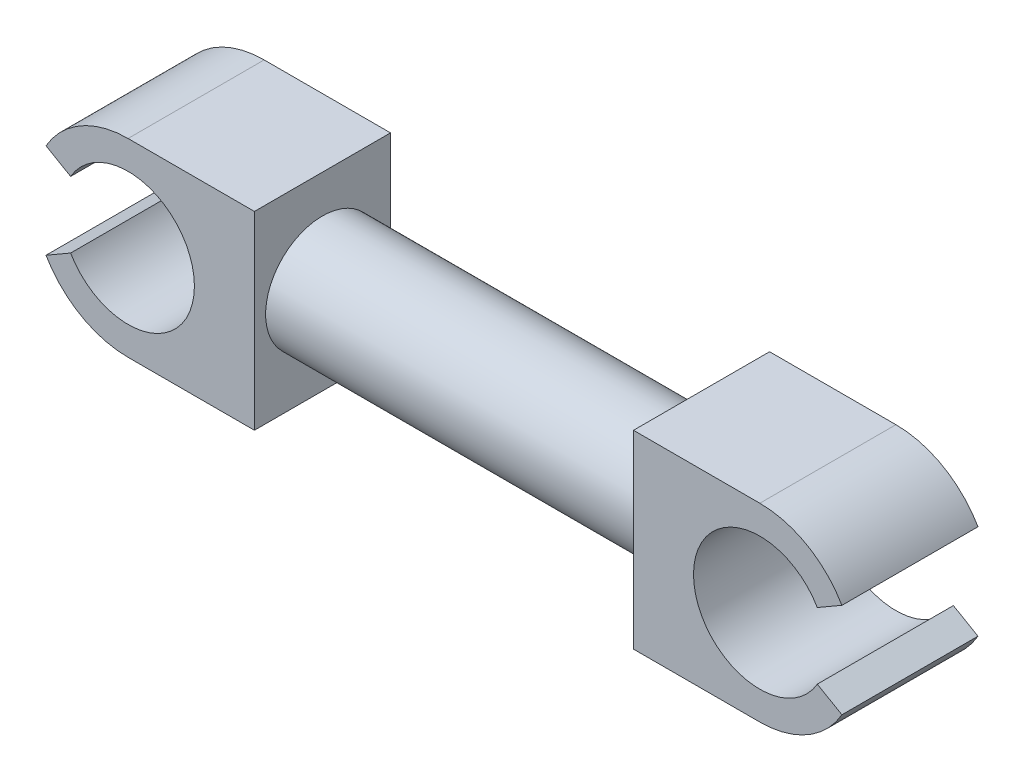
ISO-10303-21;
HEADER;
FILE_DESCRIPTION(('STEP AP214'),'2;1');
FILE_NAME('part.step','',(''),(''),'','','');
FILE_SCHEMA(('AUTOMOTIVE_DESIGN { 1 0 10303 214 1 1 1 1 }'));
ENDSEC;
DATA;
#1=APPLICATION_CONTEXT('core data for automotive mechanical design processes');
#2=APPLICATION_PROTOCOL_DEFINITION('international standard','automotive_design',2000,#1);
#3=PRODUCT_CONTEXT('',#1,'mechanical');
#4=PRODUCT('Part','Part','',(#3));
#5=PRODUCT_RELATED_PRODUCT_CATEGORY('part','',(#4));
#6=PRODUCT_DEFINITION_FORMATION('','',#4);
#7=PRODUCT_DEFINITION_CONTEXT('part definition',#1,'design');
#8=PRODUCT_DEFINITION('design','',#6,#7);
#9=PRODUCT_DEFINITION_SHAPE('','',#8);
#10=(LENGTH_UNIT() NAMED_UNIT(*) SI_UNIT(.MILLI.,.METRE.));
#11=(NAMED_UNIT(*) PLANE_ANGLE_UNIT() SI_UNIT($,.RADIAN.));
#12=(NAMED_UNIT(*) SI_UNIT($,.STERADIAN.) SOLID_ANGLE_UNIT());
#13=UNCERTAINTY_MEASURE_WITH_UNIT(LENGTH_MEASURE(1.E-05),#10,'distance_accuracy_value','');
#14=(GEOMETRIC_REPRESENTATION_CONTEXT(3) GLOBAL_UNCERTAINTY_ASSIGNED_CONTEXT((#13)) GLOBAL_UNIT_ASSIGNED_CONTEXT((#10,
#11,#12)) REPRESENTATION_CONTEXT('',''));
#15=CARTESIAN_POINT('',(0.,0.,0.));
#16=DIRECTION('',(0.,0.,1.));
#17=DIRECTION('',(1.,0.,0.));
#18=AXIS2_PLACEMENT_3D('',#15,#16,#17);
#19=CARTESIAN_POINT('',(0.,-15.,21.54));
#20=DIRECTION('',(0.,1.,0.));
#21=DIRECTION('',(0.,0.,1.));
#22=AXIS2_PLACEMENT_3D('',#19,#20,#21);
#23=PLANE('',#22);
#24=DIRECTION('',(1.,0.,0.));
#25=VECTOR('',#24,1.);
#26=CARTESIAN_POINT('',(0.,-15.,21.54));
#27=LINE('',#26,#25);
#28=CARTESIAN_POINT('',(80.,-15.,21.54));
#29=VERTEX_POINT('',#28);
#30=CARTESIAN_POINT('',(100.,-15.,21.54));
#31=VERTEX_POINT('',#30);
#32=EDGE_CURVE('E161',#29,#31,#27,.T.);
#33=ORIENTED_EDGE('',*,*,#32,.F.);
#34=DIRECTION('',(0.,0.,-1.));
#35=VECTOR('',#34,1.);
#36=CARTESIAN_POINT('',(80.,-15.,0.));
#37=LINE('',#36,#35);
#38=CARTESIAN_POINT('',(80.,-15.,0.));
#39=VERTEX_POINT('',#38);
#40=EDGE_CURVE('E148',#29,#39,#37,.T.);
#41=ORIENTED_EDGE('',*,*,#40,.T.);
#42=DIRECTION('',(1.,0.,0.));
#43=VECTOR('',#42,1.);
#44=CARTESIAN_POINT('',(0.,-15.,0.));
#45=LINE('',#44,#43);
#46=CARTESIAN_POINT('',(100.,-15.,0.));
#47=VERTEX_POINT('',#46);
#48=EDGE_CURVE('E202',#39,#47,#45,.T.);
#49=ORIENTED_EDGE('',*,*,#48,.T.);
#50=DIRECTION('',(0.,0.,-1.));
#51=VECTOR('',#50,1.);
#52=CARTESIAN_POINT('',(100.,-15.,21.54));
#53=LINE('',#52,#51);
#54=EDGE_CURVE('E168',#31,#47,#53,.T.);
#55=ORIENTED_EDGE('',*,*,#54,.F.);
#56=EDGE_LOOP('',(#33,#41,#49,#55));
#57=FACE_BOUND('',#56,.T.);
#58=ADVANCED_FACE('F37',(#57),#23,.F.);
#59=CARTESIAN_POINT('',(100.,0.,21.54));
#60=DIRECTION('',(0.,0.,-1.));
#61=DIRECTION('',(-1.,0.,0.));
#62=AXIS2_PLACEMENT_3D('',#59,#60,#61);
#63=CYLINDRICAL_SURFACE('',#62,15.);
#64=CARTESIAN_POINT('',(100.,0.,0.));
#65=DIRECTION('',(0.,0.,1.));
#66=DIRECTION('',(-1.,0.,0.));
#67=AXIS2_PLACEMENT_3D('',#64,#65,#66);
#68=CIRCLE('',#67,15.);
#69=CARTESIAN_POINT('',(112.990381056767,-7.50000000000002,0.));
#70=VERTEX_POINT('',#69);
#71=EDGE_CURVE('E206',#47,#70,#68,.T.);
#72=ORIENTED_EDGE('',*,*,#71,.T.);
#73=DIRECTION('',(0.,0.,-1.));
#74=VECTOR('',#73,1.);
#75=CARTESIAN_POINT('',(112.990381056767,-7.50000000000002,21.54));
#76=LINE('',#75,#74);
#77=CARTESIAN_POINT('',(112.990381056767,-7.50000000000002,21.54));
#78=VERTEX_POINT('',#77);
#79=EDGE_CURVE('E235',#78,#70,#76,.T.);
#80=ORIENTED_EDGE('',*,*,#79,.F.);
#81=CARTESIAN_POINT('',(100.,0.,21.54));
#82=DIRECTION('',(0.,0.,1.));
#83=DIRECTION('',(-1.,0.,0.));
#84=AXIS2_PLACEMENT_3D('',#81,#82,#83);
#85=CIRCLE('',#84,15.);
#86=EDGE_CURVE('E174',#31,#78,#85,.T.);
#87=ORIENTED_EDGE('',*,*,#86,.F.);
#88=ORIENTED_EDGE('',*,*,#54,.T.);
#89=EDGE_LOOP('',(#72,#80,#87,#88));
#90=FACE_BOUND('',#89,.T.);
#91=ADVANCED_FACE('F311',(#90),#63,.T.);
#92=CARTESIAN_POINT('',(112.990381056767,-7.50000000000002,21.54));
#93=DIRECTION('',(-0.5,-0.866025403784438,0.));
#94=DIRECTION('',(0.866025403784438,-0.500000000000001,0.));
#95=AXIS2_PLACEMENT_3D('',#92,#93,#94);
#96=PLANE('',#95);
#97=DIRECTION('',(-0.866025403784438,0.5,0.));
#98=VECTOR('',#97,1.);
#99=CARTESIAN_POINT('',(112.990381056767,-7.50000000000002,0.));
#100=LINE('',#99,#98);
#101=CARTESIAN_POINT('',(109.093266739737,-5.25000000000002,0.));
#102=VERTEX_POINT('',#101);
#103=EDGE_CURVE('E208',#70,#102,#100,.T.);
#104=ORIENTED_EDGE('',*,*,#103,.T.);
#105=DIRECTION('',(0.,0.,-1.));
#106=VECTOR('',#105,1.);
#107=CARTESIAN_POINT('',(109.093266739737,-5.25000000000002,21.54));
#108=LINE('',#107,#106);
#109=CARTESIAN_POINT('',(109.093266739737,-5.25000000000002,21.54));
#110=VERTEX_POINT('',#109);
#111=EDGE_CURVE('E232',#110,#102,#108,.T.);
#112=ORIENTED_EDGE('',*,*,#111,.F.);
#113=DIRECTION('',(-0.866025403784438,0.5,0.));
#114=VECTOR('',#113,1.);
#115=CARTESIAN_POINT('',(112.990381056767,-7.50000000000002,21.54));
#116=LINE('',#115,#114);
#117=EDGE_CURVE('E180',#78,#110,#116,.T.);
#118=ORIENTED_EDGE('',*,*,#117,.F.);
#119=ORIENTED_EDGE('',*,*,#79,.T.);
#120=EDGE_LOOP('',(#104,#112,#118,#119));
#121=FACE_BOUND('',#120,.T.);
#122=ADVANCED_FACE('F317',(#121),#96,.F.);
#123=CARTESIAN_POINT('',(100.,0.,21.54));
#124=DIRECTION('',(0.,0.,-1.));
#125=DIRECTION('',(-1.,0.,0.));
#126=AXIS2_PLACEMENT_3D('',#123,#124,#125);
#127=CYLINDRICAL_SURFACE('',#126,10.5);
#128=CARTESIAN_POINT('',(100.,0.,0.));
#129=DIRECTION('',(0.,0.,-1.));
#130=DIRECTION('',(-1.,0.,0.));
#131=AXIS2_PLACEMENT_3D('',#128,#129,#130);
#132=CIRCLE('',#131,10.5);
#133=CARTESIAN_POINT('',(109.093266739737,5.25000000000001,0.));
#134=VERTEX_POINT('',#133);
#135=EDGE_CURVE('E210',#102,#134,#132,.T.);
#136=ORIENTED_EDGE('',*,*,#135,.T.);
#137=DIRECTION('',(0.,0.,-1.));
#138=VECTOR('',#137,1.);
#139=CARTESIAN_POINT('',(109.093266739737,5.25000000000001,21.54));
#140=LINE('',#139,#138);
#141=CARTESIAN_POINT('',(109.093266739737,5.25000000000001,21.54));
#142=VERTEX_POINT('',#141);
#143=EDGE_CURVE('E229',#142,#134,#140,.T.);
#144=ORIENTED_EDGE('',*,*,#143,.F.);
#145=CARTESIAN_POINT('',(100.,0.,21.54));
#146=DIRECTION('',(0.,0.,-1.));
#147=DIRECTION('',(-1.,0.,0.));
#148=AXIS2_PLACEMENT_3D('',#145,#146,#147);
#149=CIRCLE('',#148,10.5);
#150=EDGE_CURVE('E182',#110,#142,#149,.T.);
#151=ORIENTED_EDGE('',*,*,#150,.F.);
#152=ORIENTED_EDGE('',*,*,#111,.T.);
#153=EDGE_LOOP('',(#136,#144,#151,#152));
#154=FACE_BOUND('',#153,.T.);
#155=ADVANCED_FACE('F371',(#154),#127,.F.);
#156=CARTESIAN_POINT('',(109.093266739737,5.25000000000001,21.54));
#157=DIRECTION('',(-0.500000000000001,0.866025403784438,0.));
#158=DIRECTION('',(-0.866025403784438,-0.500000000000001,0.));
#159=AXIS2_PLACEMENT_3D('',#156,#157,#158);
#160=PLANE('',#159);
#161=DIRECTION('',(0.866025403784438,0.500000000000001,0.));
#162=VECTOR('',#161,1.);
#163=CARTESIAN_POINT('',(109.093266739737,5.25000000000001,0.));
#164=LINE('',#163,#162);
#165=CARTESIAN_POINT('',(112.990381056767,7.50000000000001,0.));
#166=VERTEX_POINT('',#165);
#167=EDGE_CURVE('E212',#134,#166,#164,.T.);
#168=ORIENTED_EDGE('',*,*,#167,.T.);
#169=DIRECTION('',(0.,0.,-1.));
#170=VECTOR('',#169,1.);
#171=CARTESIAN_POINT('',(112.990381056767,7.50000000000001,21.54));
#172=LINE('',#171,#170);
#173=CARTESIAN_POINT('',(112.990381056767,7.50000000000001,21.54));
#174=VERTEX_POINT('',#173);
#175=EDGE_CURVE('E226',#174,#166,#172,.T.);
#176=ORIENTED_EDGE('',*,*,#175,.F.);
#177=DIRECTION('',(0.866025403784438,0.500000000000001,0.));
#178=VECTOR('',#177,1.);
#179=CARTESIAN_POINT('',(109.093266739737,5.25000000000001,21.54));
#180=LINE('',#179,#178);
#181=EDGE_CURVE('E184',#142,#174,#180,.T.);
#182=ORIENTED_EDGE('',*,*,#181,.F.);
#183=ORIENTED_EDGE('',*,*,#143,.T.);
#184=EDGE_LOOP('',(#168,#176,#182,#183));
#185=FACE_BOUND('',#184,.T.);
#186=ADVANCED_FACE('F365',(#185),#160,.F.);
#187=CARTESIAN_POINT('',(100.,0.,21.54));
#188=DIRECTION('',(0.,0.,-1.));
#189=DIRECTION('',(-1.,0.,0.));
#190=AXIS2_PLACEMENT_3D('',#187,#188,#189);
#191=CYLINDRICAL_SURFACE('',#190,15.);
#192=CARTESIAN_POINT('',(100.,0.,0.));
#193=DIRECTION('',(0.,0.,1.));
#194=DIRECTION('',(-1.,0.,0.));
#195=AXIS2_PLACEMENT_3D('',#192,#193,#194);
#196=CIRCLE('',#195,15.);
#197=CARTESIAN_POINT('',(100.,15.,0.));
#198=VERTEX_POINT('',#197);
#199=EDGE_CURVE('E214',#166,#198,#196,.T.);
#200=ORIENTED_EDGE('',*,*,#199,.T.);
#201=DIRECTION('',(0.,0.,-1.));
#202=VECTOR('',#201,1.);
#203=CARTESIAN_POINT('',(100.,15.,21.54));
#204=LINE('',#203,#202);
#205=CARTESIAN_POINT('',(100.,15.,21.54));
#206=VERTEX_POINT('',#205);
#207=EDGE_CURVE('E223',#206,#198,#204,.T.);
#208=ORIENTED_EDGE('',*,*,#207,.F.);
#209=CARTESIAN_POINT('',(100.,0.,21.54));
#210=DIRECTION('',(0.,0.,1.));
#211=DIRECTION('',(-1.,0.,0.));
#212=AXIS2_PLACEMENT_3D('',#209,#210,#211);
#213=CIRCLE('',#212,15.);
#214=EDGE_CURVE('E186',#174,#206,#213,.T.);
#215=ORIENTED_EDGE('',*,*,#214,.F.);
#216=ORIENTED_EDGE('',*,*,#175,.T.);
#217=EDGE_LOOP('',(#200,#208,#215,#216));
#218=FACE_BOUND('',#217,.T.);
#219=ADVANCED_FACE('F360',(#218),#191,.T.);
#220=CARTESIAN_POINT('',(0.,15.,21.54));
#221=DIRECTION('',(0.,-1.,0.));
#222=DIRECTION('',(0.,0.,-1.));
#223=AXIS2_PLACEMENT_3D('',#220,#221,#222);
#224=PLANE('',#223);
#225=DIRECTION('',(-1.,0.,0.));
#226=VECTOR('',#225,1.);
#227=CARTESIAN_POINT('',(0.,15.,0.));
#228=LINE('',#227,#226);
#229=CARTESIAN_POINT('',(80.,15.,0.));
#230=VERTEX_POINT('',#229);
#231=EDGE_CURVE('E217',#198,#230,#228,.T.);
#232=ORIENTED_EDGE('',*,*,#231,.T.);
#233=DIRECTION('',(0.,0.,1.));
#234=VECTOR('',#233,1.);
#235=CARTESIAN_POINT('',(80.,15.,0.));
#236=LINE('',#235,#234);
#237=CARTESIAN_POINT('',(80.,15.,21.54));
#238=VERTEX_POINT('',#237);
#239=EDGE_CURVE('E60',#230,#238,#236,.T.);
#240=ORIENTED_EDGE('',*,*,#239,.T.);
#241=DIRECTION('',(-1.,0.,0.));
#242=VECTOR('',#241,1.);
#243=CARTESIAN_POINT('',(0.,15.,21.54));
#244=LINE('',#243,#242);
#245=EDGE_CURVE('E164',#206,#238,#244,.T.);
#246=ORIENTED_EDGE('',*,*,#245,.F.);
#247=ORIENTED_EDGE('',*,*,#207,.T.);
#248=EDGE_LOOP('',(#232,#240,#246,#247));
#249=FACE_BOUND('',#248,.T.);
#250=ADVANCED_FACE('F329',(#249),#224,.F.);
#251=CARTESIAN_POINT('',(0.,0.,21.54));
#252=DIRECTION('',(0.,0.,1.));
#253=DIRECTION('',(1.,0.,0.));
#254=AXIS2_PLACEMENT_3D('',#251,#252,#253);
#255=PLANE('',#254);
#256=DIRECTION('',(0.,-1.,0.));
#257=VECTOR('',#256,1.);
#258=CARTESIAN_POINT('',(80.,-15.,21.54));
#259=LINE('',#258,#257);
#260=EDGE_CURVE('E152',#238,#29,#259,.T.);
#261=ORIENTED_EDGE('',*,*,#260,.T.);
#262=ORIENTED_EDGE('',*,*,#32,.T.);
#263=ORIENTED_EDGE('',*,*,#86,.T.);
#264=ORIENTED_EDGE('',*,*,#117,.T.);
#265=ORIENTED_EDGE('',*,*,#150,.T.);
#266=ORIENTED_EDGE('',*,*,#181,.T.);
#267=ORIENTED_EDGE('',*,*,#214,.T.);
#268=ORIENTED_EDGE('',*,*,#245,.T.);
#269=EDGE_LOOP('',(#261,#262,#263,#264,#265,#266,#267,#268));
#270=FACE_BOUND('',#269,.T.);
#271=ADVANCED_FACE('F160',(#270),#255,.T.);
#272=CARTESIAN_POINT('',(0.,0.,0.));
#273=DIRECTION('',(0.,0.,1.));
#274=DIRECTION('',(1.,0.,0.));
#275=AXIS2_PLACEMENT_3D('',#272,#273,#274);
#276=PLANE('',#275);
#277=ORIENTED_EDGE('',*,*,#48,.F.);
#278=DIRECTION('',(0.,1.,0.));
#279=VECTOR('',#278,1.);
#280=CARTESIAN_POINT('',(80.,-15.,0.));
#281=LINE('',#280,#279);
#282=EDGE_CURVE('E153',#39,#230,#281,.T.);
#283=ORIENTED_EDGE('',*,*,#282,.T.);
#284=ORIENTED_EDGE('',*,*,#231,.F.);
#285=ORIENTED_EDGE('',*,*,#199,.F.);
#286=ORIENTED_EDGE('',*,*,#167,.F.);
#287=ORIENTED_EDGE('',*,*,#135,.F.);
#288=ORIENTED_EDGE('',*,*,#103,.F.);
#289=ORIENTED_EDGE('',*,*,#71,.F.);
#290=EDGE_LOOP('',(#277,#283,#284,#285,#286,#287,#288,#289));
#291=FACE_BOUND('',#290,.T.);
#292=ADVANCED_FACE('F307',(#291),#276,.F.);
#293=CARTESIAN_POINT('',(80.,0.,0.));
#294=DIRECTION('',(1.,0.,0.));
#295=DIRECTION('',(0.,0.,-1.));
#296=AXIS2_PLACEMENT_3D('',#293,#294,#295);
#297=PLANE('',#296);
#298=ORIENTED_EDGE('',*,*,#260,.F.);
#299=ORIENTED_EDGE('',*,*,#239,.F.);
#300=ORIENTED_EDGE('',*,*,#282,.F.);
#301=ORIENTED_EDGE('',*,*,#40,.F.);
#302=EDGE_LOOP('',(#298,#299,#300,#301));
#303=FACE_BOUND('',#302,.T.);
#304=CARTESIAN_POINT('',(80.,0.,10.77));
#305=DIRECTION('',(1.,0.,0.));
#306=DIRECTION('',(0.,0.,-1.));
#307=AXIS2_PLACEMENT_3D('',#304,#305,#306);
#308=CIRCLE('',#307,9.);
#309=CARTESIAN_POINT('',(80.,0.,1.77));
#310=VERTEX_POINT('',#309);
#311=EDGE_CURVE('E286',#310,#310,#308,.T.);
#312=ORIENTED_EDGE('',*,*,#311,.T.);
#313=EDGE_LOOP('',(#312));
#314=FACE_BOUND('',#313,.T.);
#315=ADVANCED_FACE('F150',(#303,#314),#297,.F.);
#316=CARTESIAN_POINT('',(20.,0.,0.));
#317=DIRECTION('',(1.,0.,0.));
#318=DIRECTION('',(0.,0.,-1.));
#319=AXIS2_PLACEMENT_3D('',#316,#317,#318);
#320=PLANE('',#319);
#321=DIRECTION('',(0.,-1.,0.));
#322=VECTOR('',#321,1.);
#323=CARTESIAN_POINT('',(20.,-15.,21.54));
#324=LINE('',#323,#322);
#325=CARTESIAN_POINT('',(20.,15.,21.54));
#326=VERTEX_POINT('',#325);
#327=CARTESIAN_POINT('',(20.,-15.,21.54));
#328=VERTEX_POINT('',#327);
#329=EDGE_CURVE('E284',#326,#328,#324,.T.);
#330=ORIENTED_EDGE('',*,*,#329,.T.);
#331=DIRECTION('',(0.,0.,-1.));
#332=VECTOR('',#331,1.);
#333=CARTESIAN_POINT('',(20.,-15.,0.));
#334=LINE('',#333,#332);
#335=CARTESIAN_POINT('',(20.,-15.,0.));
#336=VERTEX_POINT('',#335);
#337=EDGE_CURVE('E52',#328,#336,#334,.T.);
#338=ORIENTED_EDGE('',*,*,#337,.T.);
#339=DIRECTION('',(0.,1.,0.));
#340=VECTOR('',#339,1.);
#341=CARTESIAN_POINT('',(20.,-15.,0.));
#342=LINE('',#341,#340);
#343=CARTESIAN_POINT('',(20.,15.,0.));
#344=VERTEX_POINT('',#343);
#345=EDGE_CURVE('E281',#336,#344,#342,.T.);
#346=ORIENTED_EDGE('',*,*,#345,.T.);
#347=DIRECTION('',(0.,0.,1.));
#348=VECTOR('',#347,1.);
#349=CARTESIAN_POINT('',(20.,15.,0.));
#350=LINE('',#349,#348);
#351=EDGE_CURVE('E165',#344,#326,#350,.T.);
#352=ORIENTED_EDGE('',*,*,#351,.T.);
#353=EDGE_LOOP('',(#330,#338,#346,#352));
#354=FACE_BOUND('',#353,.T.);
#355=CARTESIAN_POINT('',(20.,0.,10.77));
#356=DIRECTION('',(1.,0.,0.));
#357=DIRECTION('',(0.,0.,-1.));
#358=AXIS2_PLACEMENT_3D('',#355,#356,#357);
#359=CIRCLE('',#358,9.);
#360=CARTESIAN_POINT('',(20.,0.,1.77));
#361=VERTEX_POINT('',#360);
#362=EDGE_CURVE('E289',#361,#361,#359,.T.);
#363=ORIENTED_EDGE('',*,*,#362,.F.);
#364=EDGE_LOOP('',(#363));
#365=FACE_BOUND('',#364,.T.);
#366=ADVANCED_FACE('F298',(#354,#365),#320,.T.);
#367=CARTESIAN_POINT('',(80.,0.,10.77));
#368=DIRECTION('',(-1.,0.,0.));
#369=DIRECTION('',(0.,0.,1.));
#370=AXIS2_PLACEMENT_3D('',#367,#368,#369);
#371=CYLINDRICAL_SURFACE('',#370,9.);
#372=ORIENTED_EDGE('',*,*,#311,.F.);
#373=EDGE_LOOP('',(#372));
#374=FACE_BOUND('',#373,.T.);
#375=ORIENTED_EDGE('',*,*,#362,.T.);
#376=EDGE_LOOP('',(#375));
#377=FACE_BOUND('',#376,.T.);
#378=ADVANCED_FACE('F295',(#374,#377),#371,.T.);
#379=CARTESIAN_POINT('',(0.,0.,21.54));
#380=DIRECTION('',(0.,0.,-1.));
#381=DIRECTION('',(-1.,0.,0.));
#382=AXIS2_PLACEMENT_3D('',#379,#380,#381);
#383=CYLINDRICAL_SURFACE('',#382,15.);
#384=CARTESIAN_POINT('',(0.,0.,0.));
#385=DIRECTION('',(0.,0.,1.));
#386=DIRECTION('',(1.,0.,0.));
#387=AXIS2_PLACEMENT_3D('',#384,#385,#386);
#388=CIRCLE('',#387,15.);
#389=CARTESIAN_POINT('',(0.,15.,0.));
#390=VERTEX_POINT('',#389);
#391=CARTESIAN_POINT('',(-12.9903810567666,7.50000000000001,0.));
#392=VERTEX_POINT('',#391);
#393=EDGE_CURVE('E191',#390,#392,#388,.T.);
#394=ORIENTED_EDGE('',*,*,#393,.T.);
#395=DIRECTION('',(0.,0.,-1.));
#396=VECTOR('',#395,1.);
#397=CARTESIAN_POINT('',(-12.9903810567666,7.50000000000001,21.54));
#398=LINE('',#397,#396);
#399=CARTESIAN_POINT('',(-12.9903810567666,7.50000000000001,21.54));
#400=VERTEX_POINT('',#399);
#401=EDGE_CURVE('E11',#400,#392,#398,.T.);
#402=ORIENTED_EDGE('',*,*,#401,.F.);
#403=CARTESIAN_POINT('',(0.,0.,21.54));
#404=DIRECTION('',(0.,0.,1.));
#405=DIRECTION('',(1.,0.,0.));
#406=AXIS2_PLACEMENT_3D('',#403,#404,#405);
#407=CIRCLE('',#406,15.);
#408=CARTESIAN_POINT('',(0.,15.,21.54));
#409=VERTEX_POINT('',#408);
#410=EDGE_CURVE('E220',#409,#400,#407,.T.);
#411=ORIENTED_EDGE('',*,*,#410,.F.);
#412=DIRECTION('',(0.,0.,-1.));
#413=VECTOR('',#412,1.);
#414=CARTESIAN_POINT('',(0.,15.,21.54));
#415=LINE('',#414,#413);
#416=EDGE_CURVE('E190',#409,#390,#415,.T.);
#417=ORIENTED_EDGE('',*,*,#416,.T.);
#418=EDGE_LOOP('',(#394,#402,#411,#417));
#419=FACE_BOUND('',#418,.T.);
#420=ADVANCED_FACE('F39',(#419),#383,.T.);
#421=CARTESIAN_POINT('',(-9.0932667397366,5.25000000000001,21.54));
#422=DIRECTION('',(0.500000000000001,0.866025403784438,0.));
#423=DIRECTION('',(-0.866025403784438,0.500000000000001,0.));
#424=AXIS2_PLACEMENT_3D('',#421,#422,#423);
#425=PLANE('',#424);
#426=DIRECTION('',(0.866025403784438,-0.500000000000001,0.));
#427=VECTOR('',#426,1.);
#428=CARTESIAN_POINT('',(-9.0932667397366,5.25000000000001,0.));
#429=LINE('',#428,#427);
#430=CARTESIAN_POINT('',(-9.0932667397366,5.25000000000001,0.));
#431=VERTEX_POINT('',#430);
#432=EDGE_CURVE('E194',#392,#431,#429,.T.);
#433=ORIENTED_EDGE('',*,*,#432,.T.);
#434=DIRECTION('',(0.,0.,-1.));
#435=VECTOR('',#434,1.);
#436=CARTESIAN_POINT('',(-9.0932667397366,5.25000000000001,21.54));
#437=LINE('',#436,#435);
#438=CARTESIAN_POINT('',(-9.0932667397366,5.25000000000001,21.54));
#439=VERTEX_POINT('',#438);
#440=EDGE_CURVE('E45',#439,#431,#437,.T.);
#441=ORIENTED_EDGE('',*,*,#440,.F.);
#442=DIRECTION('',(0.866025403784438,-0.500000000000001,0.));
#443=VECTOR('',#442,1.);
#444=CARTESIAN_POINT('',(-9.0932667397366,5.25000000000001,21.54));
#445=LINE('',#444,#443);
#446=EDGE_CURVE('E274',#400,#439,#445,.T.);
#447=ORIENTED_EDGE('',*,*,#446,.F.);
#448=ORIENTED_EDGE('',*,*,#401,.T.);
#449=EDGE_LOOP('',(#433,#441,#447,#448));
#450=FACE_BOUND('',#449,.T.);
#451=ADVANCED_FACE('F337',(#450),#425,.F.);
#452=CARTESIAN_POINT('',(0.,0.,21.54));
#453=DIRECTION('',(0.,0.,-1.));
#454=DIRECTION('',(-1.,0.,0.));
#455=AXIS2_PLACEMENT_3D('',#452,#453,#454);
#456=CYLINDRICAL_SURFACE('',#455,10.5);
#457=CARTESIAN_POINT('',(0.,0.,0.));
#458=DIRECTION('',(0.,0.,-1.));
#459=DIRECTION('',(1.,0.,0.));
#460=AXIS2_PLACEMENT_3D('',#457,#458,#459);
#461=CIRCLE('',#460,10.5);
#462=CARTESIAN_POINT('',(-9.0932667397366,-5.25000000000001,0.));
#463=VERTEX_POINT('',#462);
#464=EDGE_CURVE('E196',#431,#463,#461,.T.);
#465=ORIENTED_EDGE('',*,*,#464,.T.);
#466=DIRECTION('',(0.,0.,-1.));
#467=VECTOR('',#466,1.);
#468=CARTESIAN_POINT('',(-9.0932667397366,-5.25000000000001,21.54));
#469=LINE('',#468,#467);
#470=CARTESIAN_POINT('',(-9.0932667397366,-5.25000000000001,21.54));
#471=VERTEX_POINT('',#470);
#472=EDGE_CURVE('E245',#471,#463,#469,.T.);
#473=ORIENTED_EDGE('',*,*,#472,.F.);
#474=CARTESIAN_POINT('',(0.,0.,21.54));
#475=DIRECTION('',(0.,0.,-1.));
#476=DIRECTION('',(1.,0.,0.));
#477=AXIS2_PLACEMENT_3D('',#474,#475,#476);
#478=CIRCLE('',#477,10.5);
#479=EDGE_CURVE('E254',#439,#471,#478,.T.);
#480=ORIENTED_EDGE('',*,*,#479,.F.);
#481=ORIENTED_EDGE('',*,*,#440,.T.);
#482=EDGE_LOOP('',(#465,#473,#480,#481));
#483=FACE_BOUND('',#482,.T.);
#484=ADVANCED_FACE('F252',(#483),#456,.F.);
#485=CARTESIAN_POINT('',(-12.9903810567666,-7.50000000000002,21.54));
#486=DIRECTION('',(0.500000000000001,-0.866025403784438,0.));
#487=DIRECTION('',(0.866025403784438,0.500000000000001,0.));
#488=AXIS2_PLACEMENT_3D('',#485,#486,#487);
#489=PLANE('',#488);
#490=DIRECTION('',(-0.866025403784438,-0.500000000000001,0.));
#491=VECTOR('',#490,1.);
#492=CARTESIAN_POINT('',(-12.9903810567666,-7.50000000000002,0.));
#493=LINE('',#492,#491);
#494=CARTESIAN_POINT('',(-12.9903810567666,-7.50000000000002,0.));
#495=VERTEX_POINT('',#494);
#496=EDGE_CURVE('E198',#463,#495,#493,.T.);
#497=ORIENTED_EDGE('',*,*,#496,.T.);
#498=DIRECTION('',(0.,0.,-1.));
#499=VECTOR('',#498,1.);
#500=CARTESIAN_POINT('',(-12.9903810567666,-7.50000000000002,21.54));
#501=LINE('',#500,#499);
#502=CARTESIAN_POINT('',(-12.9903810567666,-7.50000000000002,21.54));
#503=VERTEX_POINT('',#502);
#504=EDGE_CURVE('E242',#503,#495,#501,.T.);
#505=ORIENTED_EDGE('',*,*,#504,.F.);
#506=DIRECTION('',(-0.866025403784438,-0.500000000000001,0.));
#507=VECTOR('',#506,1.);
#508=CARTESIAN_POINT('',(-12.9903810567666,-7.50000000000002,21.54));
#509=LINE('',#508,#507);
#510=EDGE_CURVE('E175',#471,#503,#509,.T.);
#511=ORIENTED_EDGE('',*,*,#510,.F.);
#512=ORIENTED_EDGE('',*,*,#472,.T.);
#513=EDGE_LOOP('',(#497,#505,#511,#512));
#514=FACE_BOUND('',#513,.T.);
#515=ADVANCED_FACE('F264',(#514),#489,.F.);
#516=CARTESIAN_POINT('',(0.,0.,21.54));
#517=DIRECTION('',(0.,0.,-1.));
#518=DIRECTION('',(-1.,0.,0.));
#519=AXIS2_PLACEMENT_3D('',#516,#517,#518);
#520=CYLINDRICAL_SURFACE('',#519,15.);
#521=CARTESIAN_POINT('',(0.,0.,0.));
#522=DIRECTION('',(0.,0.,1.));
#523=DIRECTION('',(1.,0.,0.));
#524=AXIS2_PLACEMENT_3D('',#521,#522,#523);
#525=CIRCLE('',#524,15.);
#526=CARTESIAN_POINT('',(0.,-15.,0.));
#527=VERTEX_POINT('',#526);
#528=EDGE_CURVE('E200',#495,#527,#525,.T.);
#529=ORIENTED_EDGE('',*,*,#528,.T.);
#530=DIRECTION('',(0.,0.,-1.));
#531=VECTOR('',#530,1.);
#532=CARTESIAN_POINT('',(0.,-15.,21.54));
#533=LINE('',#532,#531);
#534=CARTESIAN_POINT('',(0.,-15.,21.54));
#535=VERTEX_POINT('',#534);
#536=EDGE_CURVE('E239',#535,#527,#533,.T.);
#537=ORIENTED_EDGE('',*,*,#536,.F.);
#538=CARTESIAN_POINT('',(0.,0.,21.54));
#539=DIRECTION('',(0.,0.,1.));
#540=DIRECTION('',(1.,0.,0.));
#541=AXIS2_PLACEMENT_3D('',#538,#539,#540);
#542=CIRCLE('',#541,15.);
#543=EDGE_CURVE('E171',#503,#535,#542,.T.);
#544=ORIENTED_EDGE('',*,*,#543,.F.);
#545=ORIENTED_EDGE('',*,*,#504,.T.);
#546=EDGE_LOOP('',(#529,#537,#544,#545));
#547=FACE_BOUND('',#546,.T.);
#548=ADVANCED_FACE('F268',(#547),#520,.T.);
#549=EDGE_CURVE('E170',#535,#328,#27,.T.);
#550=ORIENTED_EDGE('',*,*,#549,.T.);
#551=ORIENTED_EDGE('',*,*,#329,.F.);
#552=EDGE_CURVE('E188',#326,#409,#244,.T.);
#553=ORIENTED_EDGE('',*,*,#552,.T.);
#554=ORIENTED_EDGE('',*,*,#410,.T.);
#555=ORIENTED_EDGE('',*,*,#446,.T.);
#556=ORIENTED_EDGE('',*,*,#479,.T.);
#557=ORIENTED_EDGE('',*,*,#510,.T.);
#558=ORIENTED_EDGE('',*,*,#543,.T.);
#559=EDGE_LOOP('',(#550,#551,#553,#554,#555,#556,#557,#558));
#560=FACE_BOUND('',#559,.T.);
#561=ADVANCED_FACE('F272',(#560),#255,.T.);
#562=ORIENTED_EDGE('',*,*,#345,.F.);
#563=EDGE_CURVE('E203',#527,#336,#45,.T.);
#564=ORIENTED_EDGE('',*,*,#563,.F.);
#565=ORIENTED_EDGE('',*,*,#528,.F.);
#566=ORIENTED_EDGE('',*,*,#496,.F.);
#567=ORIENTED_EDGE('',*,*,#464,.F.);
#568=ORIENTED_EDGE('',*,*,#432,.F.);
#569=ORIENTED_EDGE('',*,*,#393,.F.);
#570=EDGE_CURVE('E216',#344,#390,#228,.T.);
#571=ORIENTED_EDGE('',*,*,#570,.F.);
#572=EDGE_LOOP('',(#562,#564,#565,#566,#567,#568,#569,#571));
#573=FACE_BOUND('',#572,.T.);
#574=ADVANCED_FACE('F258',(#573),#276,.F.);
#575=ORIENTED_EDGE('',*,*,#351,.F.);
#576=ORIENTED_EDGE('',*,*,#570,.T.);
#577=ORIENTED_EDGE('',*,*,#416,.F.);
#578=ORIENTED_EDGE('',*,*,#552,.F.);
#579=EDGE_LOOP('',(#575,#576,#577,#578));
#580=FACE_BOUND('',#579,.T.);
#581=ADVANCED_FACE('F322',(#580),#224,.F.);
#582=ORIENTED_EDGE('',*,*,#337,.F.);
#583=ORIENTED_EDGE('',*,*,#549,.F.);
#584=ORIENTED_EDGE('',*,*,#536,.T.);
#585=ORIENTED_EDGE('',*,*,#563,.T.);
#586=EDGE_LOOP('',(#582,#583,#584,#585));
#587=FACE_BOUND('',#586,.T.);
#588=ADVANCED_FACE('F313',(#587),#23,.F.);
#589=CLOSED_SHELL('',(#58,#91,#122,#155,#186,#219,#250,#271,#292,#315,#366,#378,#420,#451,#484,
#515,#548,#561,#574,#581,#588));
#590=MANIFOLD_SOLID_BREP('B2',#589);
#591=ADVANCED_BREP_SHAPE_REPRESENTATION('',(#18,#590),#14);
#592=SHAPE_DEFINITION_REPRESENTATION(#9,#591);
ENDSEC;
END-ISO-10303-21;
